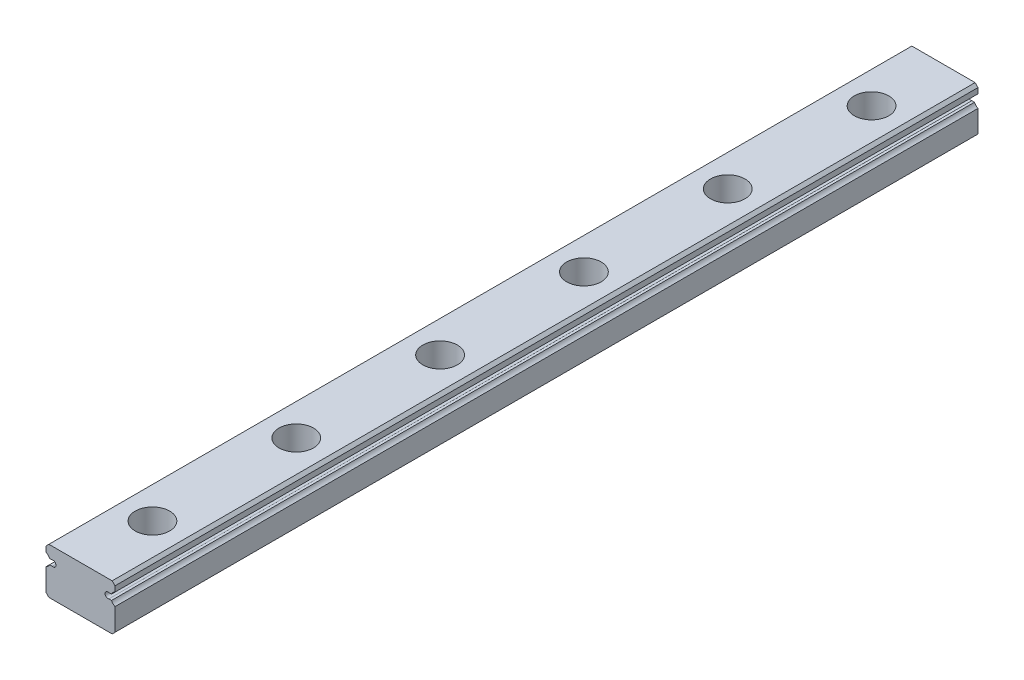
ISO-10303-21;
HEADER;
FILE_DESCRIPTION(('STEP AP214'),'2;1');
FILE_NAME('part.step','',(''),(''),'','','');
FILE_SCHEMA(('AUTOMOTIVE_DESIGN { 1 0 10303 214 1 1 1 1 }'));
ENDSEC;
DATA;
#1=APPLICATION_CONTEXT('core data for automotive mechanical design processes');
#2=APPLICATION_PROTOCOL_DEFINITION('international standard','automotive_design',2000,#1);
#3=PRODUCT_CONTEXT('',#1,'mechanical');
#4=PRODUCT('Part','Part','',(#3));
#5=PRODUCT_RELATED_PRODUCT_CATEGORY('part','',(#4));
#6=PRODUCT_DEFINITION_FORMATION('','',#4);
#7=PRODUCT_DEFINITION_CONTEXT('part definition',#1,'design');
#8=PRODUCT_DEFINITION('design','',#6,#7);
#9=PRODUCT_DEFINITION_SHAPE('','',#8);
#10=(LENGTH_UNIT() NAMED_UNIT(*) SI_UNIT(.MILLI.,.METRE.));
#11=(NAMED_UNIT(*) PLANE_ANGLE_UNIT() SI_UNIT($,.RADIAN.));
#12=(NAMED_UNIT(*) SI_UNIT($,.STERADIAN.) SOLID_ANGLE_UNIT());
#13=UNCERTAINTY_MEASURE_WITH_UNIT(LENGTH_MEASURE(1.E-05),#10,'distance_accuracy_value','');
#14=(GEOMETRIC_REPRESENTATION_CONTEXT(3) GLOBAL_UNCERTAINTY_ASSIGNED_CONTEXT((#13)) GLOBAL_UNIT_ASSIGNED_CONTEXT((#10,
#11,#12)) REPRESENTATION_CONTEXT('',''));
#15=CARTESIAN_POINT('',(0.,0.,0.));
#16=DIRECTION('',(0.,0.,1.));
#17=DIRECTION('',(1.,0.,0.));
#18=AXIS2_PLACEMENT_3D('',#15,#16,#17);
#19=CARTESIAN_POINT('',(6.,0.,150.));
#20=DIRECTION('',(-1.,0.,0.));
#21=DIRECTION('',(0.,0.,1.));
#22=AXIS2_PLACEMENT_3D('',#19,#20,#21);
#23=PLANE('',#22);
#24=DIRECTION('',(0.,1.,0.));
#25=VECTOR('',#24,1.);
#26=CARTESIAN_POINT('',(6.,0.,0.));
#27=LINE('',#26,#25);
#28=CARTESIAN_POINT('',(6.,-3.5,0.));
#29=VERTEX_POINT('',#28);
#30=CARTESIAN_POINT('',(6.,0.368911094364901,0.));
#31=VERTEX_POINT('',#30);
#32=EDGE_CURVE('E210',#29,#31,#27,.T.);
#33=ORIENTED_EDGE('',*,*,#32,.T.);
#34=DIRECTION('',(0.,0.,-1.));
#35=VECTOR('',#34,1.);
#36=CARTESIAN_POINT('',(6.,0.368911094364901,150.));
#37=LINE('',#36,#35);
#38=CARTESIAN_POINT('',(6.,0.368911094364901,150.));
#39=VERTEX_POINT('',#38);
#40=EDGE_CURVE('E11',#39,#31,#37,.T.);
#41=ORIENTED_EDGE('',*,*,#40,.F.);
#42=DIRECTION('',(0.,1.,0.));
#43=VECTOR('',#42,1.);
#44=CARTESIAN_POINT('',(6.,0.,150.));
#45=LINE('',#44,#43);
#46=CARTESIAN_POINT('',(6.,-3.5,150.));
#47=VERTEX_POINT('',#46);
#48=EDGE_CURVE('E262',#47,#39,#45,.T.);
#49=ORIENTED_EDGE('',*,*,#48,.F.);
#50=DIRECTION('',(0.,0.,-1.));
#51=VECTOR('',#50,1.);
#52=CARTESIAN_POINT('',(6.,-3.5,150.));
#53=LINE('',#52,#51);
#54=EDGE_CURVE('E206',#47,#29,#53,.T.);
#55=ORIENTED_EDGE('',*,*,#54,.T.);
#56=EDGE_LOOP('',(#33,#41,#49,#55));
#57=FACE_BOUND('',#56,.T.);
#58=ADVANCED_FACE('F43',(#57),#23,.F.);
#59=CARTESIAN_POINT('',(6.475,1.46,150.));
#60=DIRECTION('',(0.,0.,-1.));
#61=DIRECTION('',(-1.,0.,0.));
#62=AXIS2_PLACEMENT_3D('',#59,#60,#61);
#63=CYLINDRICAL_SURFACE('',#62,1.19);
#64=CARTESIAN_POINT('',(6.475,1.46,0.));
#65=DIRECTION('',(0.,0.,1.));
#66=DIRECTION('',(1.,0.,0.));
#67=AXIS2_PLACEMENT_3D('',#64,#65,#66);
#68=CIRCLE('',#67,1.19);
#69=CARTESIAN_POINT('',(5.3839110943649,0.985,0.));
#70=VERTEX_POINT('',#69);
#71=EDGE_CURVE('E213',#31,#70,#68,.F.);
#72=ORIENTED_EDGE('',*,*,#71,.T.);
#73=DIRECTION('',(0.,0.,-1.));
#74=VECTOR('',#73,1.);
#75=CARTESIAN_POINT('',(5.3839110943649,0.985,150.));
#76=LINE('',#75,#74);
#77=CARTESIAN_POINT('',(5.3839110943649,0.985,150.));
#78=VERTEX_POINT('',#77);
#79=EDGE_CURVE('E51',#78,#70,#76,.T.);
#80=ORIENTED_EDGE('',*,*,#79,.F.);
#81=CARTESIAN_POINT('',(6.475,1.46,150.));
#82=DIRECTION('',(0.,0.,1.));
#83=DIRECTION('',(1.,0.,0.));
#84=AXIS2_PLACEMENT_3D('',#81,#82,#83);
#85=CIRCLE('',#84,1.19);
#86=EDGE_CURVE('E134',#39,#78,#85,.F.);
#87=ORIENTED_EDGE('',*,*,#86,.F.);
#88=ORIENTED_EDGE('',*,*,#40,.T.);
#89=EDGE_LOOP('',(#72,#80,#87,#88));
#90=FACE_BOUND('',#89,.T.);
#91=ADVANCED_FACE('F369',(#90),#63,.F.);
#92=CARTESIAN_POINT('',(0.,0.985000000000015,150.));
#93=DIRECTION('',(0.,-1.,0.));
#94=DIRECTION('',(1.,0.,0.));
#95=AXIS2_PLACEMENT_3D('',#92,#93,#94);
#96=PLANE('',#95);
#97=DIRECTION('',(-1.,0.,0.));
#98=VECTOR('',#97,1.);
#99=CARTESIAN_POINT('',(0.,0.985000000000015,0.));
#100=LINE('',#99,#98);
#101=CARTESIAN_POINT('',(4.92112494995996,0.985000000000002,0.));
#102=VERTEX_POINT('',#101);
#103=EDGE_CURVE('E216',#70,#102,#100,.T.);
#104=ORIENTED_EDGE('',*,*,#103,.T.);
#105=DIRECTION('',(0.,0.,-1.));
#106=VECTOR('',#105,1.);
#107=CARTESIAN_POINT('',(4.92112494995996,0.985000000000002,150.));
#108=LINE('',#107,#106);
#109=CARTESIAN_POINT('',(4.92112494995996,0.985000000000002,150.));
#110=VERTEX_POINT('',#109);
#111=EDGE_CURVE('E294',#110,#102,#108,.T.);
#112=ORIENTED_EDGE('',*,*,#111,.F.);
#113=DIRECTION('',(-1.,0.,0.));
#114=VECTOR('',#113,1.);
#115=CARTESIAN_POINT('',(0.,0.985000000000015,150.));
#116=LINE('',#115,#114);
#117=EDGE_CURVE('E302',#78,#110,#116,.T.);
#118=ORIENTED_EDGE('',*,*,#117,.F.);
#119=ORIENTED_EDGE('',*,*,#79,.T.);
#120=EDGE_LOOP('',(#104,#112,#118,#119));
#121=FACE_BOUND('',#120,.T.);
#122=ADVANCED_FACE('F300',(#121),#96,.F.);
#123=CARTESIAN_POINT('',(4.765,1.46,150.));
#124=DIRECTION('',(0.,0.,-1.));
#125=DIRECTION('',(-1.,0.,0.));
#126=AXIS2_PLACEMENT_3D('',#123,#124,#125);
#127=CYLINDRICAL_SURFACE('',#126,0.5);
#128=CARTESIAN_POINT('',(4.765,1.46,0.));
#129=DIRECTION('',(0.,0.,1.));
#130=DIRECTION('',(1.,0.,0.));
#131=AXIS2_PLACEMENT_3D('',#128,#129,#130);
#132=CIRCLE('',#131,0.5);
#133=CARTESIAN_POINT('',(4.92112494995996,1.935,0.));
#134=VERTEX_POINT('',#133);
#135=EDGE_CURVE('E218',#102,#134,#132,.F.);
#136=ORIENTED_EDGE('',*,*,#135,.T.);
#137=DIRECTION('',(0.,0.,-1.));
#138=VECTOR('',#137,1.);
#139=CARTESIAN_POINT('',(4.92112494995996,1.935,150.));
#140=LINE('',#139,#138);
#141=CARTESIAN_POINT('',(4.92112494995996,1.935,150.));
#142=VERTEX_POINT('',#141);
#143=EDGE_CURVE('E292',#142,#134,#140,.T.);
#144=ORIENTED_EDGE('',*,*,#143,.F.);
#145=CARTESIAN_POINT('',(4.765,1.46,150.));
#146=DIRECTION('',(0.,0.,1.));
#147=DIRECTION('',(1.,0.,0.));
#148=AXIS2_PLACEMENT_3D('',#145,#146,#147);
#149=CIRCLE('',#148,0.5);
#150=EDGE_CURVE('E314',#110,#142,#149,.F.);
#151=ORIENTED_EDGE('',*,*,#150,.F.);
#152=ORIENTED_EDGE('',*,*,#111,.T.);
#153=EDGE_LOOP('',(#136,#144,#151,#152));
#154=FACE_BOUND('',#153,.T.);
#155=ADVANCED_FACE('F311',(#154),#127,.F.);
#156=CARTESIAN_POINT('',(0.,1.93500000000002,150.));
#157=DIRECTION('',(0.,-1.,0.));
#158=DIRECTION('',(1.,0.,0.));
#159=AXIS2_PLACEMENT_3D('',#156,#157,#158);
#160=PLANE('',#159);
#161=DIRECTION('',(-1.,0.,0.));
#162=VECTOR('',#161,1.);
#163=CARTESIAN_POINT('',(0.,1.93500000000002,0.));
#164=LINE('',#163,#162);
#165=CARTESIAN_POINT('',(5.3839110943649,1.935,0.));
#166=VERTEX_POINT('',#165);
#167=EDGE_CURVE('E221',#166,#134,#164,.T.);
#168=ORIENTED_EDGE('',*,*,#167,.F.);
#169=DIRECTION('',(0.,0.,-1.));
#170=VECTOR('',#169,1.);
#171=CARTESIAN_POINT('',(5.3839110943649,1.935,150.));
#172=LINE('',#171,#170);
#173=CARTESIAN_POINT('',(5.3839110943649,1.935,150.));
#174=VERTEX_POINT('',#173);
#175=EDGE_CURVE('E290',#174,#166,#172,.T.);
#176=ORIENTED_EDGE('',*,*,#175,.F.);
#177=DIRECTION('',(-1.,0.,0.));
#178=VECTOR('',#177,1.);
#179=CARTESIAN_POINT('',(0.,1.93500000000002,150.));
#180=LINE('',#179,#178);
#181=EDGE_CURVE('E316',#174,#142,#180,.T.);
#182=ORIENTED_EDGE('',*,*,#181,.T.);
#183=ORIENTED_EDGE('',*,*,#143,.T.);
#184=EDGE_LOOP('',(#168,#176,#182,#183));
#185=FACE_BOUND('',#184,.T.);
#186=ADVANCED_FACE('F380',(#185),#160,.T.);
#187=CARTESIAN_POINT('',(6.475,1.46,150.));
#188=DIRECTION('',(0.,0.,-1.));
#189=DIRECTION('',(-1.,0.,0.));
#190=AXIS2_PLACEMENT_3D('',#187,#188,#189);
#191=CYLINDRICAL_SURFACE('',#190,1.19);
#192=CARTESIAN_POINT('',(6.475,1.46,0.));
#193=DIRECTION('',(0.,0.,1.));
#194=DIRECTION('',(1.,0.,0.));
#195=AXIS2_PLACEMENT_3D('',#192,#193,#194);
#196=CIRCLE('',#195,1.19);
#197=CARTESIAN_POINT('',(6.,2.5510889056351,0.));
#198=VERTEX_POINT('',#197);
#199=EDGE_CURVE('E224',#166,#198,#196,.F.);
#200=ORIENTED_EDGE('',*,*,#199,.T.);
#201=DIRECTION('',(0.,0.,-1.));
#202=VECTOR('',#201,1.);
#203=CARTESIAN_POINT('',(6.,2.5510889056351,150.));
#204=LINE('',#203,#202);
#205=CARTESIAN_POINT('',(6.,2.5510889056351,150.));
#206=VERTEX_POINT('',#205);
#207=EDGE_CURVE('E287',#206,#198,#204,.T.);
#208=ORIENTED_EDGE('',*,*,#207,.F.);
#209=CARTESIAN_POINT('',(6.475,1.46,150.));
#210=DIRECTION('',(0.,0.,1.));
#211=DIRECTION('',(1.,0.,0.));
#212=AXIS2_PLACEMENT_3D('',#209,#210,#211);
#213=CIRCLE('',#212,1.19);
#214=EDGE_CURVE('E318',#174,#206,#213,.F.);
#215=ORIENTED_EDGE('',*,*,#214,.F.);
#216=ORIENTED_EDGE('',*,*,#175,.T.);
#217=EDGE_LOOP('',(#200,#208,#215,#216));
#218=FACE_BOUND('',#217,.T.);
#219=ADVANCED_FACE('F383',(#218),#191,.F.);
#220=CARTESIAN_POINT('',(6.00000000000001,0.,150.));
#221=DIRECTION('',(-1.,0.,0.));
#222=DIRECTION('',(0.,-1.,0.));
#223=AXIS2_PLACEMENT_3D('',#220,#221,#222);
#224=PLANE('',#223);
#225=DIRECTION('',(0.,1.,0.));
#226=VECTOR('',#225,1.);
#227=CARTESIAN_POINT('',(6.00000000000001,0.,0.));
#228=LINE('',#227,#226);
#229=CARTESIAN_POINT('',(6.,3.5,0.));
#230=VERTEX_POINT('',#229);
#231=EDGE_CURVE('E226',#198,#230,#228,.T.);
#232=ORIENTED_EDGE('',*,*,#231,.T.);
#233=DIRECTION('',(0.,0.,-1.));
#234=VECTOR('',#233,1.);
#235=CARTESIAN_POINT('',(6.,3.5,150.));
#236=LINE('',#235,#234);
#237=CARTESIAN_POINT('',(6.,3.5,150.));
#238=VERTEX_POINT('',#237);
#239=EDGE_CURVE('E285',#238,#230,#236,.T.);
#240=ORIENTED_EDGE('',*,*,#239,.F.);
#241=DIRECTION('',(0.,1.,0.));
#242=VECTOR('',#241,1.);
#243=CARTESIAN_POINT('',(6.00000000000001,0.,150.));
#244=LINE('',#243,#242);
#245=EDGE_CURVE('E324',#206,#238,#244,.T.);
#246=ORIENTED_EDGE('',*,*,#245,.F.);
#247=ORIENTED_EDGE('',*,*,#207,.T.);
#248=EDGE_LOOP('',(#232,#240,#246,#247));
#249=FACE_BOUND('',#248,.T.);
#250=ADVANCED_FACE('F387',(#249),#224,.F.);
#251=CARTESIAN_POINT('',(4.74999999999999,4.75,150.));
#252=DIRECTION('',(0.707106781186547,0.707106781186548,0.));
#253=DIRECTION('',(-0.707106781186548,0.707106781186547,0.));
#254=AXIS2_PLACEMENT_3D('',#251,#252,#253);
#255=PLANE('',#254);
#256=DIRECTION('',(0.707106781186548,-0.707106781186547,0.));
#257=VECTOR('',#256,1.);
#258=CARTESIAN_POINT('',(4.74999999999999,4.75,0.));
#259=LINE('',#258,#257);
#260=CARTESIAN_POINT('',(5.5,4.,0.));
#261=VERTEX_POINT('',#260);
#262=EDGE_CURVE('E229',#261,#230,#259,.T.);
#263=ORIENTED_EDGE('',*,*,#262,.F.);
#264=DIRECTION('',(0.,0.,-1.));
#265=VECTOR('',#264,1.);
#266=CARTESIAN_POINT('',(5.5,4.,150.));
#267=LINE('',#266,#265);
#268=CARTESIAN_POINT('',(5.5,4.,150.));
#269=VERTEX_POINT('',#268);
#270=EDGE_CURVE('E283',#269,#261,#267,.T.);
#271=ORIENTED_EDGE('',*,*,#270,.F.);
#272=DIRECTION('',(0.707106781186548,-0.707106781186547,0.));
#273=VECTOR('',#272,1.);
#274=CARTESIAN_POINT('',(4.74999999999999,4.75,150.));
#275=LINE('',#274,#273);
#276=EDGE_CURVE('E326',#269,#238,#275,.T.);
#277=ORIENTED_EDGE('',*,*,#276,.T.);
#278=ORIENTED_EDGE('',*,*,#239,.T.);
#279=EDGE_LOOP('',(#263,#271,#277,#278));
#280=FACE_BOUND('',#279,.T.);
#281=ADVANCED_FACE('F391',(#280),#255,.T.);
#282=CARTESIAN_POINT('',(0.,4.,150.));
#283=DIRECTION('',(0.,-1.,0.));
#284=DIRECTION('',(1.,0.,0.));
#285=AXIS2_PLACEMENT_3D('',#282,#283,#284);
#286=PLANE('',#285);
#287=CARTESIAN_POINT('',(0.,4.,137.5));
#288=DIRECTION('',(0.,1.,0.));
#289=DIRECTION('',(-1.,0.,0.));
#290=AXIS2_PLACEMENT_3D('',#287,#288,#289);
#291=CIRCLE('',#290,3.);
#292=CARTESIAN_POINT('',(-3.,4.,137.5));
#293=VERTEX_POINT('',#292);
#294=EDGE_CURVE('E745',#293,#293,#291,.T.);
#295=ORIENTED_EDGE('',*,*,#294,.F.);
#296=EDGE_LOOP('',(#295));
#297=FACE_BOUND('',#296,.T.);
#298=CARTESIAN_POINT('',(0.,4.,112.5));
#299=DIRECTION('',(0.,1.,0.));
#300=DIRECTION('',(-1.,0.,0.));
#301=AXIS2_PLACEMENT_3D('',#298,#299,#300);
#302=CIRCLE('',#301,3.);
#303=CARTESIAN_POINT('',(-3.,4.,112.5));
#304=VERTEX_POINT('',#303);
#305=EDGE_CURVE('E756',#304,#304,#302,.T.);
#306=ORIENTED_EDGE('',*,*,#305,.F.);
#307=EDGE_LOOP('',(#306));
#308=FACE_BOUND('',#307,.T.);
#309=CARTESIAN_POINT('',(0.,4.,87.5));
#310=DIRECTION('',(0.,1.,0.));
#311=DIRECTION('',(-1.,0.,0.));
#312=AXIS2_PLACEMENT_3D('',#309,#310,#311);
#313=CIRCLE('',#312,3.);
#314=CARTESIAN_POINT('',(-3.,4.,87.5));
#315=VERTEX_POINT('',#314);
#316=EDGE_CURVE('E768',#315,#315,#313,.T.);
#317=ORIENTED_EDGE('',*,*,#316,.F.);
#318=EDGE_LOOP('',(#317));
#319=FACE_BOUND('',#318,.T.);
#320=CARTESIAN_POINT('',(0.,4.,62.5));
#321=DIRECTION('',(0.,1.,0.));
#322=DIRECTION('',(-1.,0.,0.));
#323=AXIS2_PLACEMENT_3D('',#320,#321,#322);
#324=CIRCLE('',#323,3.);
#325=CARTESIAN_POINT('',(-3.,4.,62.5));
#326=VERTEX_POINT('',#325);
#327=EDGE_CURVE('E780',#326,#326,#324,.T.);
#328=ORIENTED_EDGE('',*,*,#327,.F.);
#329=EDGE_LOOP('',(#328));
#330=FACE_BOUND('',#329,.T.);
#331=CARTESIAN_POINT('',(0.,4.,37.5));
#332=DIRECTION('',(0.,1.,0.));
#333=DIRECTION('',(-1.,0.,0.));
#334=AXIS2_PLACEMENT_3D('',#331,#332,#333);
#335=CIRCLE('',#334,3.);
#336=CARTESIAN_POINT('',(-3.,4.,37.5));
#337=VERTEX_POINT('',#336);
#338=EDGE_CURVE('E792',#337,#337,#335,.T.);
#339=ORIENTED_EDGE('',*,*,#338,.F.);
#340=EDGE_LOOP('',(#339));
#341=FACE_BOUND('',#340,.T.);
#342=CARTESIAN_POINT('',(0.,4.,12.5));
#343=DIRECTION('',(0.,1.,0.));
#344=DIRECTION('',(-1.,0.,0.));
#345=AXIS2_PLACEMENT_3D('',#342,#343,#344);
#346=CIRCLE('',#345,3.);
#347=CARTESIAN_POINT('',(-3.,4.,12.5));
#348=VERTEX_POINT('',#347);
#349=EDGE_CURVE('E805',#348,#348,#346,.T.);
#350=ORIENTED_EDGE('',*,*,#349,.F.);
#351=EDGE_LOOP('',(#350));
#352=FACE_BOUND('',#351,.T.);
#353=DIRECTION('',(-1.,0.,0.));
#354=VECTOR('',#353,1.);
#355=CARTESIAN_POINT('',(0.,4.,0.));
#356=LINE('',#355,#354);
#357=CARTESIAN_POINT('',(-5.5,4.,0.));
#358=VERTEX_POINT('',#357);
#359=EDGE_CURVE('E232',#261,#358,#356,.T.);
#360=ORIENTED_EDGE('',*,*,#359,.T.);
#361=DIRECTION('',(0.,0.,-1.));
#362=VECTOR('',#361,1.);
#363=CARTESIAN_POINT('',(-5.5,4.,150.));
#364=LINE('',#363,#362);
#365=CARTESIAN_POINT('',(-5.5,4.,150.));
#366=VERTEX_POINT('',#365);
#367=EDGE_CURVE('E280',#366,#358,#364,.T.);
#368=ORIENTED_EDGE('',*,*,#367,.F.);
#369=DIRECTION('',(-1.,0.,0.));
#370=VECTOR('',#369,1.);
#371=CARTESIAN_POINT('',(0.,4.,150.));
#372=LINE('',#371,#370);
#373=EDGE_CURVE('E329',#269,#366,#372,.T.);
#374=ORIENTED_EDGE('',*,*,#373,.F.);
#375=ORIENTED_EDGE('',*,*,#270,.T.);
#376=EDGE_LOOP('',(#360,#368,#374,#375));
#377=FACE_BOUND('',#376,.T.);
#378=ADVANCED_FACE('F395',(#297,#308,#319,#330,#341,#352,#377),#286,.F.);
#379=CARTESIAN_POINT('',(-4.75,4.75,150.));
#380=DIRECTION('',(0.707106781186547,-0.707106781186548,0.));
#381=DIRECTION('',(0.707106781186548,0.707106781186547,0.));
#382=AXIS2_PLACEMENT_3D('',#379,#380,#381);
#383=PLANE('',#382);
#384=DIRECTION('',(-0.707106781186548,-0.707106781186547,0.));
#385=VECTOR('',#384,1.);
#386=CARTESIAN_POINT('',(-4.75,4.75,0.));
#387=LINE('',#386,#385);
#388=CARTESIAN_POINT('',(-6.,3.5,0.));
#389=VERTEX_POINT('',#388);
#390=EDGE_CURVE('E234',#358,#389,#387,.T.);
#391=ORIENTED_EDGE('',*,*,#390,.T.);
#392=DIRECTION('',(0.,0.,-1.));
#393=VECTOR('',#392,1.);
#394=CARTESIAN_POINT('',(-6.,3.5,150.));
#395=LINE('',#394,#393);
#396=CARTESIAN_POINT('',(-6.,3.5,150.));
#397=VERTEX_POINT('',#396);
#398=EDGE_CURVE('E278',#397,#389,#395,.T.);
#399=ORIENTED_EDGE('',*,*,#398,.F.);
#400=DIRECTION('',(-0.707106781186548,-0.707106781186547,0.));
#401=VECTOR('',#400,1.);
#402=CARTESIAN_POINT('',(-4.75,4.75,150.));
#403=LINE('',#402,#401);
#404=EDGE_CURVE('E331',#366,#397,#403,.T.);
#405=ORIENTED_EDGE('',*,*,#404,.F.);
#406=ORIENTED_EDGE('',*,*,#367,.T.);
#407=EDGE_LOOP('',(#391,#399,#405,#406));
#408=FACE_BOUND('',#407,.T.);
#409=ADVANCED_FACE('F399',(#408),#383,.F.);
#410=CARTESIAN_POINT('',(-6.,0.,150.));
#411=DIRECTION('',(-1.,0.,0.));
#412=DIRECTION('',(0.,0.,1.));
#413=AXIS2_PLACEMENT_3D('',#410,#411,#412);
#414=PLANE('',#413);
#415=DIRECTION('',(0.,1.,0.));
#416=VECTOR('',#415,1.);
#417=CARTESIAN_POINT('',(-6.,0.,0.));
#418=LINE('',#417,#416);
#419=CARTESIAN_POINT('',(-6.,2.5510889056351,0.));
#420=VERTEX_POINT('',#419);
#421=EDGE_CURVE('E237',#420,#389,#418,.T.);
#422=ORIENTED_EDGE('',*,*,#421,.F.);
#423=DIRECTION('',(0.,0.,-1.));
#424=VECTOR('',#423,1.);
#425=CARTESIAN_POINT('',(-6.,2.5510889056351,150.));
#426=LINE('',#425,#424);
#427=CARTESIAN_POINT('',(-6.,2.5510889056351,150.));
#428=VERTEX_POINT('',#427);
#429=EDGE_CURVE('E276',#428,#420,#426,.T.);
#430=ORIENTED_EDGE('',*,*,#429,.F.);
#431=DIRECTION('',(0.,1.,0.));
#432=VECTOR('',#431,1.);
#433=CARTESIAN_POINT('',(-6.,0.,150.));
#434=LINE('',#433,#432);
#435=EDGE_CURVE('E333',#428,#397,#434,.T.);
#436=ORIENTED_EDGE('',*,*,#435,.T.);
#437=ORIENTED_EDGE('',*,*,#398,.T.);
#438=EDGE_LOOP('',(#422,#430,#436,#437));
#439=FACE_BOUND('',#438,.T.);
#440=ADVANCED_FACE('F403',(#439),#414,.T.);
#441=CARTESIAN_POINT('',(-6.475,1.46,150.));
#442=DIRECTION('',(0.,0.,-1.));
#443=DIRECTION('',(-1.,0.,0.));
#444=AXIS2_PLACEMENT_3D('',#441,#442,#443);
#445=CYLINDRICAL_SURFACE('',#444,1.19);
#446=CARTESIAN_POINT('',(-6.475,1.46,0.));
#447=DIRECTION('',(0.,0.,1.));
#448=DIRECTION('',(1.,0.,0.));
#449=AXIS2_PLACEMENT_3D('',#446,#447,#448);
#450=CIRCLE('',#449,1.19);
#451=CARTESIAN_POINT('',(-5.3839110943649,1.935,0.));
#452=VERTEX_POINT('',#451);
#453=EDGE_CURVE('E240',#452,#420,#450,.T.);
#454=ORIENTED_EDGE('',*,*,#453,.F.);
#455=DIRECTION('',(0.,0.,-1.));
#456=VECTOR('',#455,1.);
#457=CARTESIAN_POINT('',(-5.3839110943649,1.935,150.));
#458=LINE('',#457,#456);
#459=CARTESIAN_POINT('',(-5.3839110943649,1.935,150.));
#460=VERTEX_POINT('',#459);
#461=EDGE_CURVE('E274',#460,#452,#458,.T.);
#462=ORIENTED_EDGE('',*,*,#461,.F.);
#463=CARTESIAN_POINT('',(-6.475,1.46,150.));
#464=DIRECTION('',(0.,0.,1.));
#465=DIRECTION('',(1.,0.,0.));
#466=AXIS2_PLACEMENT_3D('',#463,#464,#465);
#467=CIRCLE('',#466,1.19);
#468=EDGE_CURVE('E336',#460,#428,#467,.T.);
#469=ORIENTED_EDGE('',*,*,#468,.T.);
#470=ORIENTED_EDGE('',*,*,#429,.T.);
#471=EDGE_LOOP('',(#454,#462,#469,#470));
#472=FACE_BOUND('',#471,.T.);
#473=ADVANCED_FACE('F407',(#472),#445,.F.);
#474=CARTESIAN_POINT('',(0.,1.935,150.));
#475=DIRECTION('',(0.,1.,0.));
#476=DIRECTION('',(0.,0.,1.));
#477=AXIS2_PLACEMENT_3D('',#474,#475,#476);
#478=PLANE('',#477);
#479=DIRECTION('',(1.,0.,0.));
#480=VECTOR('',#479,1.);
#481=CARTESIAN_POINT('',(0.,1.935,0.));
#482=LINE('',#481,#480);
#483=CARTESIAN_POINT('',(-4.92112494995996,1.935,0.));
#484=VERTEX_POINT('',#483);
#485=EDGE_CURVE('E243',#452,#484,#482,.T.);
#486=ORIENTED_EDGE('',*,*,#485,.T.);
#487=DIRECTION('',(0.,0.,-1.));
#488=VECTOR('',#487,1.);
#489=CARTESIAN_POINT('',(-4.92112494995996,1.935,150.));
#490=LINE('',#489,#488);
#491=CARTESIAN_POINT('',(-4.92112494995996,1.935,150.));
#492=VERTEX_POINT('',#491);
#493=EDGE_CURVE('E272',#492,#484,#490,.T.);
#494=ORIENTED_EDGE('',*,*,#493,.F.);
#495=DIRECTION('',(1.,0.,0.));
#496=VECTOR('',#495,1.);
#497=CARTESIAN_POINT('',(0.,1.935,150.));
#498=LINE('',#497,#496);
#499=EDGE_CURVE('E339',#460,#492,#498,.T.);
#500=ORIENTED_EDGE('',*,*,#499,.F.);
#501=ORIENTED_EDGE('',*,*,#461,.T.);
#502=EDGE_LOOP('',(#486,#494,#500,#501));
#503=FACE_BOUND('',#502,.T.);
#504=ADVANCED_FACE('F411',(#503),#478,.F.);
#505=CARTESIAN_POINT('',(-4.765,1.46,150.));
#506=DIRECTION('',(0.,0.,-1.));
#507=DIRECTION('',(-1.,0.,0.));
#508=AXIS2_PLACEMENT_3D('',#505,#506,#507);
#509=CYLINDRICAL_SURFACE('',#508,0.5);
#510=CARTESIAN_POINT('',(-4.765,1.46,0.));
#511=DIRECTION('',(0.,0.,1.));
#512=DIRECTION('',(1.,0.,0.));
#513=AXIS2_PLACEMENT_3D('',#510,#511,#512);
#514=CIRCLE('',#513,0.5);
#515=CARTESIAN_POINT('',(-4.92112494995996,0.984999999999999,0.));
#516=VERTEX_POINT('',#515);
#517=EDGE_CURVE('E246',#516,#484,#514,.T.);
#518=ORIENTED_EDGE('',*,*,#517,.F.);
#519=DIRECTION('',(0.,0.,-1.));
#520=VECTOR('',#519,1.);
#521=CARTESIAN_POINT('',(-4.92112494995996,0.984999999999999,150.));
#522=LINE('',#521,#520);
#523=CARTESIAN_POINT('',(-4.92112494995996,0.984999999999999,150.));
#524=VERTEX_POINT('',#523);
#525=EDGE_CURVE('E270',#524,#516,#522,.T.);
#526=ORIENTED_EDGE('',*,*,#525,.F.);
#527=CARTESIAN_POINT('',(-4.765,1.46,150.));
#528=DIRECTION('',(0.,0.,1.));
#529=DIRECTION('',(1.,0.,0.));
#530=AXIS2_PLACEMENT_3D('',#527,#528,#529);
#531=CIRCLE('',#530,0.5);
#532=EDGE_CURVE('E341',#524,#492,#531,.T.);
#533=ORIENTED_EDGE('',*,*,#532,.T.);
#534=ORIENTED_EDGE('',*,*,#493,.T.);
#535=EDGE_LOOP('',(#518,#526,#533,#534));
#536=FACE_BOUND('',#535,.T.);
#537=ADVANCED_FACE('F415',(#536),#509,.F.);
#538=CARTESIAN_POINT('',(0.,0.984999999999999,150.));
#539=DIRECTION('',(0.,1.,0.));
#540=DIRECTION('',(0.,0.,1.));
#541=AXIS2_PLACEMENT_3D('',#538,#539,#540);
#542=PLANE('',#541);
#543=DIRECTION('',(1.,0.,0.));
#544=VECTOR('',#543,1.);
#545=CARTESIAN_POINT('',(0.,0.984999999999999,0.));
#546=LINE('',#545,#544);
#547=CARTESIAN_POINT('',(-5.3839110943649,0.984999999999999,0.));
#548=VERTEX_POINT('',#547);
#549=EDGE_CURVE('E249',#548,#516,#546,.T.);
#550=ORIENTED_EDGE('',*,*,#549,.F.);
#551=DIRECTION('',(0.,0.,-1.));
#552=VECTOR('',#551,1.);
#553=CARTESIAN_POINT('',(-5.3839110943649,0.984999999999999,150.));
#554=LINE('',#553,#552);
#555=CARTESIAN_POINT('',(-5.3839110943649,0.984999999999999,150.));
#556=VERTEX_POINT('',#555);
#557=EDGE_CURVE('E268',#556,#548,#554,.T.);
#558=ORIENTED_EDGE('',*,*,#557,.F.);
#559=DIRECTION('',(1.,0.,0.));
#560=VECTOR('',#559,1.);
#561=CARTESIAN_POINT('',(0.,0.984999999999999,150.));
#562=LINE('',#561,#560);
#563=EDGE_CURVE('E344',#556,#524,#562,.T.);
#564=ORIENTED_EDGE('',*,*,#563,.T.);
#565=ORIENTED_EDGE('',*,*,#525,.T.);
#566=EDGE_LOOP('',(#550,#558,#564,#565));
#567=FACE_BOUND('',#566,.T.);
#568=ADVANCED_FACE('F419',(#567),#542,.T.);
#569=CARTESIAN_POINT('',(-6.475,1.46,150.));
#570=DIRECTION('',(0.,0.,-1.));
#571=DIRECTION('',(-1.,0.,0.));
#572=AXIS2_PLACEMENT_3D('',#569,#570,#571);
#573=CYLINDRICAL_SURFACE('',#572,1.19);
#574=CARTESIAN_POINT('',(-6.475,1.46,0.));
#575=DIRECTION('',(0.,0.,1.));
#576=DIRECTION('',(1.,0.,0.));
#577=AXIS2_PLACEMENT_3D('',#574,#575,#576);
#578=CIRCLE('',#577,1.19);
#579=CARTESIAN_POINT('',(-6.,0.3689110943649,0.));
#580=VERTEX_POINT('',#579);
#581=EDGE_CURVE('E252',#580,#548,#578,.T.);
#582=ORIENTED_EDGE('',*,*,#581,.F.);
#583=DIRECTION('',(0.,0.,-1.));
#584=VECTOR('',#583,1.);
#585=CARTESIAN_POINT('',(-6.,0.3689110943649,150.));
#586=LINE('',#585,#584);
#587=CARTESIAN_POINT('',(-6.,0.3689110943649,150.));
#588=VERTEX_POINT('',#587);
#589=EDGE_CURVE('E266',#588,#580,#586,.T.);
#590=ORIENTED_EDGE('',*,*,#589,.F.);
#591=CARTESIAN_POINT('',(-6.475,1.46,150.));
#592=DIRECTION('',(0.,0.,1.));
#593=DIRECTION('',(1.,0.,0.));
#594=AXIS2_PLACEMENT_3D('',#591,#592,#593);
#595=CIRCLE('',#594,1.19);
#596=EDGE_CURVE('E347',#588,#556,#595,.T.);
#597=ORIENTED_EDGE('',*,*,#596,.T.);
#598=ORIENTED_EDGE('',*,*,#557,.T.);
#599=EDGE_LOOP('',(#582,#590,#597,#598));
#600=FACE_BOUND('',#599,.T.);
#601=ADVANCED_FACE('F423',(#600),#573,.F.);
#602=CARTESIAN_POINT('',(-6.,0.,150.));
#603=DIRECTION('',(-1.,0.,0.));
#604=DIRECTION('',(0.,0.,1.));
#605=AXIS2_PLACEMENT_3D('',#602,#603,#604);
#606=PLANE('',#605);
#607=DIRECTION('',(0.,1.,0.));
#608=VECTOR('',#607,1.);
#609=CARTESIAN_POINT('',(-6.,0.,0.));
#610=LINE('',#609,#608);
#611=CARTESIAN_POINT('',(-6.,-3.5,0.));
#612=VERTEX_POINT('',#611);
#613=EDGE_CURVE('E255',#612,#580,#610,.T.);
#614=ORIENTED_EDGE('',*,*,#613,.F.);
#615=DIRECTION('',(0.,0.,-1.));
#616=VECTOR('',#615,1.);
#617=CARTESIAN_POINT('',(-6.,-3.5,150.));
#618=LINE('',#617,#616);
#619=CARTESIAN_POINT('',(-6.,-3.5,150.));
#620=VERTEX_POINT('',#619);
#621=EDGE_CURVE('E195',#620,#612,#618,.T.);
#622=ORIENTED_EDGE('',*,*,#621,.F.);
#623=DIRECTION('',(0.,1.,0.));
#624=VECTOR('',#623,1.);
#625=CARTESIAN_POINT('',(-6.,0.,150.));
#626=LINE('',#625,#624);
#627=EDGE_CURVE('E202',#620,#588,#626,.T.);
#628=ORIENTED_EDGE('',*,*,#627,.T.);
#629=ORIENTED_EDGE('',*,*,#589,.T.);
#630=EDGE_LOOP('',(#614,#622,#628,#629));
#631=FACE_BOUND('',#630,.T.);
#632=ADVANCED_FACE('F351',(#631),#606,.T.);
#633=CARTESIAN_POINT('',(-4.75,-4.75,150.));
#634=DIRECTION('',(-0.707106781186548,-0.707106781186547,0.));
#635=DIRECTION('',(0.707106781186547,-0.707106781186548,0.));
#636=AXIS2_PLACEMENT_3D('',#633,#634,#635);
#637=PLANE('',#636);
#638=DIRECTION('',(-0.707106781186547,0.707106781186548,0.));
#639=VECTOR('',#638,1.);
#640=CARTESIAN_POINT('',(-4.75,-4.75,0.));
#641=LINE('',#640,#639);
#642=CARTESIAN_POINT('',(-5.5,-4.,0.));
#643=VERTEX_POINT('',#642);
#644=EDGE_CURVE('E190',#643,#612,#641,.T.);
#645=ORIENTED_EDGE('',*,*,#644,.F.);
#646=DIRECTION('',(0.,0.,-1.));
#647=VECTOR('',#646,1.);
#648=CARTESIAN_POINT('',(-5.5,-4.,150.));
#649=LINE('',#648,#647);
#650=CARTESIAN_POINT('',(-5.5,-4.,150.));
#651=VERTEX_POINT('',#650);
#652=EDGE_CURVE('E185',#651,#643,#649,.T.);
#653=ORIENTED_EDGE('',*,*,#652,.F.);
#654=DIRECTION('',(-0.707106781186547,0.707106781186548,0.));
#655=VECTOR('',#654,1.);
#656=CARTESIAN_POINT('',(-4.75,-4.75,150.));
#657=LINE('',#656,#655);
#658=EDGE_CURVE('E188',#651,#620,#657,.T.);
#659=ORIENTED_EDGE('',*,*,#658,.T.);
#660=ORIENTED_EDGE('',*,*,#621,.T.);
#661=EDGE_LOOP('',(#645,#653,#659,#660));
#662=FACE_BOUND('',#661,.T.);
#663=ADVANCED_FACE('F187',(#662),#637,.T.);
#664=CARTESIAN_POINT('',(0.,-4.,150.));
#665=DIRECTION('',(0.,-1.,0.));
#666=DIRECTION('',(1.,0.,0.));
#667=AXIS2_PLACEMENT_3D('',#664,#665,#666);
#668=PLANE('',#667);
#669=CARTESIAN_POINT('',(0.,-4.,137.5));
#670=DIRECTION('',(0.,1.,0.));
#671=DIRECTION('',(-1.,0.,0.));
#672=AXIS2_PLACEMENT_3D('',#669,#670,#671);
#673=CIRCLE('',#672,1.75);
#674=CARTESIAN_POINT('',(-1.75,-4.,137.5));
#675=VERTEX_POINT('',#674);
#676=EDGE_CURVE('E740',#675,#675,#673,.T.);
#677=ORIENTED_EDGE('',*,*,#676,.T.);
#678=EDGE_LOOP('',(#677));
#679=FACE_BOUND('',#678,.T.);
#680=CARTESIAN_POINT('',(0.,-4.,112.5));
#681=DIRECTION('',(0.,1.,0.));
#682=DIRECTION('',(-1.,0.,0.));
#683=AXIS2_PLACEMENT_3D('',#680,#681,#682);
#684=CIRCLE('',#683,1.75);
#685=CARTESIAN_POINT('',(-1.75,-4.,112.5));
#686=VERTEX_POINT('',#685);
#687=EDGE_CURVE('E748',#686,#686,#684,.T.);
#688=ORIENTED_EDGE('',*,*,#687,.T.);
#689=EDGE_LOOP('',(#688));
#690=FACE_BOUND('',#689,.T.);
#691=CARTESIAN_POINT('',(0.,-4.,87.5));
#692=DIRECTION('',(0.,1.,0.));
#693=DIRECTION('',(-1.,0.,0.));
#694=AXIS2_PLACEMENT_3D('',#691,#692,#693);
#695=CIRCLE('',#694,1.75);
#696=CARTESIAN_POINT('',(-1.75,-4.,87.5));
#697=VERTEX_POINT('',#696);
#698=EDGE_CURVE('E765',#697,#697,#695,.T.);
#699=ORIENTED_EDGE('',*,*,#698,.T.);
#700=EDGE_LOOP('',(#699));
#701=FACE_BOUND('',#700,.T.);
#702=CARTESIAN_POINT('',(0.,-4.,62.5));
#703=DIRECTION('',(0.,1.,0.));
#704=DIRECTION('',(-1.,0.,0.));
#705=AXIS2_PLACEMENT_3D('',#702,#703,#704);
#706=CIRCLE('',#705,1.75);
#707=CARTESIAN_POINT('',(-1.75,-4.,62.5));
#708=VERTEX_POINT('',#707);
#709=EDGE_CURVE('E777',#708,#708,#706,.T.);
#710=ORIENTED_EDGE('',*,*,#709,.T.);
#711=EDGE_LOOP('',(#710));
#712=FACE_BOUND('',#711,.T.);
#713=CARTESIAN_POINT('',(0.,-4.,37.5));
#714=DIRECTION('',(0.,1.,0.));
#715=DIRECTION('',(-1.,0.,0.));
#716=AXIS2_PLACEMENT_3D('',#713,#714,#715);
#717=CIRCLE('',#716,1.75);
#718=CARTESIAN_POINT('',(-1.75,-4.,37.5));
#719=VERTEX_POINT('',#718);
#720=EDGE_CURVE('E789',#719,#719,#717,.T.);
#721=ORIENTED_EDGE('',*,*,#720,.T.);
#722=EDGE_LOOP('',(#721));
#723=FACE_BOUND('',#722,.T.);
#724=CARTESIAN_POINT('',(0.,-4.,12.5));
#725=DIRECTION('',(0.,1.,0.));
#726=DIRECTION('',(-1.,0.,0.));
#727=AXIS2_PLACEMENT_3D('',#724,#725,#726);
#728=CIRCLE('',#727,1.75);
#729=CARTESIAN_POINT('',(-1.75,-4.,12.5));
#730=VERTEX_POINT('',#729);
#731=EDGE_CURVE('E802',#730,#730,#728,.T.);
#732=ORIENTED_EDGE('',*,*,#731,.T.);
#733=EDGE_LOOP('',(#732));
#734=FACE_BOUND('',#733,.T.);
#735=DIRECTION('',(-1.,0.,0.));
#736=VECTOR('',#735,1.);
#737=CARTESIAN_POINT('',(0.,-4.,0.));
#738=LINE('',#737,#736);
#739=CARTESIAN_POINT('',(5.5,-4.,0.));
#740=VERTEX_POINT('',#739);
#741=EDGE_CURVE('E259',#740,#643,#738,.T.);
#742=ORIENTED_EDGE('',*,*,#741,.F.);
#743=DIRECTION('',(0.,0.,-1.));
#744=VECTOR('',#743,1.);
#745=CARTESIAN_POINT('',(5.5,-4.,150.));
#746=LINE('',#745,#744);
#747=CARTESIAN_POINT('',(5.5,-4.,150.));
#748=VERTEX_POINT('',#747);
#749=EDGE_CURVE('E123',#748,#740,#746,.T.);
#750=ORIENTED_EDGE('',*,*,#749,.F.);
#751=DIRECTION('',(-1.,0.,0.));
#752=VECTOR('',#751,1.);
#753=CARTESIAN_POINT('',(0.,-4.,150.));
#754=LINE('',#753,#752);
#755=EDGE_CURVE('E199',#748,#651,#754,.T.);
#756=ORIENTED_EDGE('',*,*,#755,.T.);
#757=ORIENTED_EDGE('',*,*,#652,.T.);
#758=EDGE_LOOP('',(#742,#750,#756,#757));
#759=FACE_BOUND('',#758,.T.);
#760=ADVANCED_FACE('F204',(#679,#690,#701,#712,#723,#734,#759),#668,.T.);
#761=CARTESIAN_POINT('',(4.75,-4.75,150.));
#762=DIRECTION('',(-0.707106781186548,0.707106781186547,0.));
#763=DIRECTION('',(-0.707106781186547,-0.707106781186548,0.));
#764=AXIS2_PLACEMENT_3D('',#761,#762,#763);
#765=PLANE('',#764);
#766=DIRECTION('',(0.707106781186547,0.707106781186548,0.));
#767=VECTOR('',#766,1.);
#768=CARTESIAN_POINT('',(4.75,-4.75,0.));
#769=LINE('',#768,#767);
#770=EDGE_CURVE('E126',#740,#29,#769,.T.);
#771=ORIENTED_EDGE('',*,*,#770,.T.);
#772=ORIENTED_EDGE('',*,*,#54,.F.);
#773=DIRECTION('',(0.707106781186547,0.707106781186548,0.));
#774=VECTOR('',#773,1.);
#775=CARTESIAN_POINT('',(4.75,-4.75,150.));
#776=LINE('',#775,#774);
#777=EDGE_CURVE('E59',#748,#47,#776,.T.);
#778=ORIENTED_EDGE('',*,*,#777,.F.);
#779=ORIENTED_EDGE('',*,*,#749,.T.);
#780=EDGE_LOOP('',(#771,#772,#778,#779));
#781=FACE_BOUND('',#780,.T.);
#782=ADVANCED_FACE('F356',(#781),#765,.F.);
#783=CARTESIAN_POINT('',(0.,0.,150.));
#784=DIRECTION('',(0.,0.,1.));
#785=DIRECTION('',(1.,0.,0.));
#786=AXIS2_PLACEMENT_3D('',#783,#784,#785);
#787=PLANE('',#786);
#788=ORIENTED_EDGE('',*,*,#48,.T.);
#789=ORIENTED_EDGE('',*,*,#86,.T.);
#790=ORIENTED_EDGE('',*,*,#117,.T.);
#791=ORIENTED_EDGE('',*,*,#150,.T.);
#792=ORIENTED_EDGE('',*,*,#181,.F.);
#793=ORIENTED_EDGE('',*,*,#214,.T.);
#794=ORIENTED_EDGE('',*,*,#245,.T.);
#795=ORIENTED_EDGE('',*,*,#276,.F.);
#796=ORIENTED_EDGE('',*,*,#373,.T.);
#797=ORIENTED_EDGE('',*,*,#404,.T.);
#798=ORIENTED_EDGE('',*,*,#435,.F.);
#799=ORIENTED_EDGE('',*,*,#468,.F.);
#800=ORIENTED_EDGE('',*,*,#499,.T.);
#801=ORIENTED_EDGE('',*,*,#532,.F.);
#802=ORIENTED_EDGE('',*,*,#563,.F.);
#803=ORIENTED_EDGE('',*,*,#596,.F.);
#804=ORIENTED_EDGE('',*,*,#627,.F.);
#805=ORIENTED_EDGE('',*,*,#658,.F.);
#806=ORIENTED_EDGE('',*,*,#755,.F.);
#807=ORIENTED_EDGE('',*,*,#777,.T.);
#808=EDGE_LOOP('',(#788,#789,#790,#791,#792,#793,#794,#795,#796,#797,#798,#799,#800,#801,#802,
#803,#804,#805,#806,#807));
#809=FACE_BOUND('',#808,.T.);
#810=ADVANCED_FACE('F198',(#809),#787,.T.);
#811=CARTESIAN_POINT('',(0.,0.,0.));
#812=DIRECTION('',(0.,0.,1.));
#813=DIRECTION('',(1.,0.,0.));
#814=AXIS2_PLACEMENT_3D('',#811,#812,#813);
#815=PLANE('',#814);
#816=ORIENTED_EDGE('',*,*,#32,.F.);
#817=ORIENTED_EDGE('',*,*,#770,.F.);
#818=ORIENTED_EDGE('',*,*,#741,.T.);
#819=ORIENTED_EDGE('',*,*,#644,.T.);
#820=ORIENTED_EDGE('',*,*,#613,.T.);
#821=ORIENTED_EDGE('',*,*,#581,.T.);
#822=ORIENTED_EDGE('',*,*,#549,.T.);
#823=ORIENTED_EDGE('',*,*,#517,.T.);
#824=ORIENTED_EDGE('',*,*,#485,.F.);
#825=ORIENTED_EDGE('',*,*,#453,.T.);
#826=ORIENTED_EDGE('',*,*,#421,.T.);
#827=ORIENTED_EDGE('',*,*,#390,.F.);
#828=ORIENTED_EDGE('',*,*,#359,.F.);
#829=ORIENTED_EDGE('',*,*,#262,.T.);
#830=ORIENTED_EDGE('',*,*,#231,.F.);
#831=ORIENTED_EDGE('',*,*,#199,.F.);
#832=ORIENTED_EDGE('',*,*,#167,.T.);
#833=ORIENTED_EDGE('',*,*,#135,.F.);
#834=ORIENTED_EDGE('',*,*,#103,.F.);
#835=ORIENTED_EDGE('',*,*,#71,.F.);
#836=EDGE_LOOP('',(#816,#817,#818,#819,#820,#821,#822,#823,#824,#825,#826,#827,#828,#829,#830,
#831,#832,#833,#834,#835));
#837=FACE_BOUND('',#836,.T.);
#838=ADVANCED_FACE('F306',(#837),#815,.F.);
#839=CARTESIAN_POINT('',(0.,-0.499999999999999,12.5));
#840=DIRECTION('',(0.,1.,0.));
#841=DIRECTION('',(-1.,0.,0.));
#842=AXIS2_PLACEMENT_3D('',#839,#840,#841);
#843=CYLINDRICAL_SURFACE('',#842,3.);
#844=CARTESIAN_POINT('',(0.,-0.499999999999999,12.5));
#845=DIRECTION('',(0.,1.,0.));
#846=DIRECTION('',(-1.,0.,0.));
#847=AXIS2_PLACEMENT_3D('',#844,#845,#846);
#848=CIRCLE('',#847,3.);
#849=CARTESIAN_POINT('',(-3.,-0.5,12.5));
#850=VERTEX_POINT('',#849);
#851=EDGE_CURVE('E214',#850,#850,#848,.T.);
#852=ORIENTED_EDGE('',*,*,#851,.F.);
#853=EDGE_LOOP('',(#852));
#854=FACE_BOUND('',#853,.T.);
#855=ORIENTED_EDGE('',*,*,#349,.T.);
#856=EDGE_LOOP('',(#855));
#857=FACE_BOUND('',#856,.T.);
#858=ADVANCED_FACE('F552',(#854,#857),#843,.F.);
#859=CARTESIAN_POINT('',(0.,-0.499999999999999,12.5));
#860=DIRECTION('',(0.,1.,0.));
#861=DIRECTION('',(-1.,0.,0.));
#862=AXIS2_PLACEMENT_3D('',#859,#860,#861);
#863=PLANE('',#862);
#864=CARTESIAN_POINT('',(0.,-0.499999999999999,12.5));
#865=DIRECTION('',(0.,1.,0.));
#866=DIRECTION('',(-1.,0.,0.));
#867=AXIS2_PLACEMENT_3D('',#864,#865,#866);
#868=CIRCLE('',#867,1.75);
#869=CARTESIAN_POINT('',(-1.75,-0.499999999999999,12.5));
#870=VERTEX_POINT('',#869);
#871=EDGE_CURVE('E801',#870,#870,#868,.T.);
#872=ORIENTED_EDGE('',*,*,#871,.F.);
#873=EDGE_LOOP('',(#872));
#874=FACE_BOUND('',#873,.T.);
#875=ORIENTED_EDGE('',*,*,#851,.T.);
#876=EDGE_LOOP('',(#875));
#877=FACE_BOUND('',#876,.T.);
#878=ADVANCED_FACE('F559',(#874,#877),#863,.T.);
#879=CARTESIAN_POINT('',(0.,-4.,12.5));
#880=DIRECTION('',(0.,1.,0.));
#881=DIRECTION('',(-1.,0.,0.));
#882=AXIS2_PLACEMENT_3D('',#879,#880,#881);
#883=CYLINDRICAL_SURFACE('',#882,1.75);
#884=ORIENTED_EDGE('',*,*,#731,.F.);
#885=EDGE_LOOP('',(#884));
#886=FACE_BOUND('',#885,.T.);
#887=ORIENTED_EDGE('',*,*,#871,.T.);
#888=EDGE_LOOP('',(#887));
#889=FACE_BOUND('',#888,.T.);
#890=ADVANCED_FACE('F568',(#886,#889),#883,.F.);
#891=CARTESIAN_POINT('',(0.,-0.499999999999999,37.5));
#892=DIRECTION('',(0.,1.,0.));
#893=DIRECTION('',(-1.,0.,0.));
#894=AXIS2_PLACEMENT_3D('',#891,#892,#893);
#895=CYLINDRICAL_SURFACE('',#894,3.);
#896=CARTESIAN_POINT('',(0.,-0.499999999999999,37.5));
#897=DIRECTION('',(0.,1.,0.));
#898=DIRECTION('',(-1.,0.,0.));
#899=AXIS2_PLACEMENT_3D('',#896,#897,#898);
#900=CIRCLE('',#899,3.);
#901=CARTESIAN_POINT('',(-3.,-0.5,37.5));
#902=VERTEX_POINT('',#901);
#903=EDGE_CURVE('E798',#902,#902,#900,.T.);
#904=ORIENTED_EDGE('',*,*,#903,.F.);
#905=EDGE_LOOP('',(#904));
#906=FACE_BOUND('',#905,.T.);
#907=ORIENTED_EDGE('',*,*,#338,.T.);
#908=EDGE_LOOP('',(#907));
#909=FACE_BOUND('',#908,.T.);
#910=ADVANCED_FACE('F577',(#906,#909),#895,.F.);
#911=CARTESIAN_POINT('',(0.,-0.499999999999999,37.5));
#912=DIRECTION('',(0.,1.,0.));
#913=DIRECTION('',(-1.,0.,0.));
#914=AXIS2_PLACEMENT_3D('',#911,#912,#913);
#915=PLANE('',#914);
#916=CARTESIAN_POINT('',(0.,-0.499999999999999,37.5));
#917=DIRECTION('',(0.,1.,0.));
#918=DIRECTION('',(-1.,0.,0.));
#919=AXIS2_PLACEMENT_3D('',#916,#917,#918);
#920=CIRCLE('',#919,1.75);
#921=CARTESIAN_POINT('',(-1.75,-0.499999999999999,37.5));
#922=VERTEX_POINT('',#921);
#923=EDGE_CURVE('E795',#922,#922,#920,.T.);
#924=ORIENTED_EDGE('',*,*,#923,.F.);
#925=EDGE_LOOP('',(#924));
#926=FACE_BOUND('',#925,.T.);
#927=ORIENTED_EDGE('',*,*,#903,.T.);
#928=EDGE_LOOP('',(#927));
#929=FACE_BOUND('',#928,.T.);
#930=ADVANCED_FACE('F586',(#926,#929),#915,.T.);
#931=CARTESIAN_POINT('',(0.,-4.,37.5));
#932=DIRECTION('',(0.,1.,0.));
#933=DIRECTION('',(-1.,0.,0.));
#934=AXIS2_PLACEMENT_3D('',#931,#932,#933);
#935=CYLINDRICAL_SURFACE('',#934,1.75);
#936=ORIENTED_EDGE('',*,*,#720,.F.);
#937=EDGE_LOOP('',(#936));
#938=FACE_BOUND('',#937,.T.);
#939=ORIENTED_EDGE('',*,*,#923,.T.);
#940=EDGE_LOOP('',(#939));
#941=FACE_BOUND('',#940,.T.);
#942=ADVANCED_FACE('F595',(#938,#941),#935,.F.);
#943=CARTESIAN_POINT('',(0.,-0.499999999999999,62.5));
#944=DIRECTION('',(0.,1.,0.));
#945=DIRECTION('',(-1.,0.,0.));
#946=AXIS2_PLACEMENT_3D('',#943,#944,#945);
#947=CYLINDRICAL_SURFACE('',#946,3.);
#948=CARTESIAN_POINT('',(0.,-0.499999999999999,62.5));
#949=DIRECTION('',(0.,1.,0.));
#950=DIRECTION('',(-1.,0.,0.));
#951=AXIS2_PLACEMENT_3D('',#948,#949,#950);
#952=CIRCLE('',#951,3.);
#953=CARTESIAN_POINT('',(-3.,-0.5,62.5));
#954=VERTEX_POINT('',#953);
#955=EDGE_CURVE('E786',#954,#954,#952,.T.);
#956=ORIENTED_EDGE('',*,*,#955,.F.);
#957=EDGE_LOOP('',(#956));
#958=FACE_BOUND('',#957,.T.);
#959=ORIENTED_EDGE('',*,*,#327,.T.);
#960=EDGE_LOOP('',(#959));
#961=FACE_BOUND('',#960,.T.);
#962=ADVANCED_FACE('F604',(#958,#961),#947,.F.);
#963=CARTESIAN_POINT('',(0.,-0.499999999999999,62.5));
#964=DIRECTION('',(0.,1.,0.));
#965=DIRECTION('',(-1.,0.,0.));
#966=AXIS2_PLACEMENT_3D('',#963,#964,#965);
#967=PLANE('',#966);
#968=CARTESIAN_POINT('',(0.,-0.499999999999999,62.5));
#969=DIRECTION('',(0.,1.,0.));
#970=DIRECTION('',(-1.,0.,0.));
#971=AXIS2_PLACEMENT_3D('',#968,#969,#970);
#972=CIRCLE('',#971,1.75);
#973=CARTESIAN_POINT('',(-1.75,-0.499999999999999,62.5));
#974=VERTEX_POINT('',#973);
#975=EDGE_CURVE('E783',#974,#974,#972,.T.);
#976=ORIENTED_EDGE('',*,*,#975,.F.);
#977=EDGE_LOOP('',(#976));
#978=FACE_BOUND('',#977,.T.);
#979=ORIENTED_EDGE('',*,*,#955,.T.);
#980=EDGE_LOOP('',(#979));
#981=FACE_BOUND('',#980,.T.);
#982=ADVANCED_FACE('F613',(#978,#981),#967,.T.);
#983=CARTESIAN_POINT('',(0.,-4.,62.5));
#984=DIRECTION('',(0.,1.,0.));
#985=DIRECTION('',(-1.,0.,0.));
#986=AXIS2_PLACEMENT_3D('',#983,#984,#985);
#987=CYLINDRICAL_SURFACE('',#986,1.75);
#988=ORIENTED_EDGE('',*,*,#709,.F.);
#989=EDGE_LOOP('',(#988));
#990=FACE_BOUND('',#989,.T.);
#991=ORIENTED_EDGE('',*,*,#975,.T.);
#992=EDGE_LOOP('',(#991));
#993=FACE_BOUND('',#992,.T.);
#994=ADVANCED_FACE('F622',(#990,#993),#987,.F.);
#995=CARTESIAN_POINT('',(0.,-0.499999999999999,87.5));
#996=DIRECTION('',(0.,1.,0.));
#997=DIRECTION('',(-1.,0.,0.));
#998=AXIS2_PLACEMENT_3D('',#995,#996,#997);
#999=CYLINDRICAL_SURFACE('',#998,3.);
#1000=CARTESIAN_POINT('',(0.,-0.499999999999999,87.5));
#1001=DIRECTION('',(0.,1.,0.));
#1002=DIRECTION('',(-1.,0.,0.));
#1003=AXIS2_PLACEMENT_3D('',#1000,#1001,#1002);
#1004=CIRCLE('',#1003,3.);
#1005=CARTESIAN_POINT('',(-3.,-0.5,87.5));
#1006=VERTEX_POINT('',#1005);
#1007=EDGE_CURVE('E774',#1006,#1006,#1004,.T.);
#1008=ORIENTED_EDGE('',*,*,#1007,.F.);
#1009=EDGE_LOOP('',(#1008));
#1010=FACE_BOUND('',#1009,.T.);
#1011=ORIENTED_EDGE('',*,*,#316,.T.);
#1012=EDGE_LOOP('',(#1011));
#1013=FACE_BOUND('',#1012,.T.);
#1014=ADVANCED_FACE('F631',(#1010,#1013),#999,.F.);
#1015=CARTESIAN_POINT('',(0.,-0.499999999999999,87.5));
#1016=DIRECTION('',(0.,1.,0.));
#1017=DIRECTION('',(-1.,0.,0.));
#1018=AXIS2_PLACEMENT_3D('',#1015,#1016,#1017);
#1019=PLANE('',#1018);
#1020=CARTESIAN_POINT('',(0.,-0.499999999999999,87.5));
#1021=DIRECTION('',(0.,1.,0.));
#1022=DIRECTION('',(-1.,0.,0.));
#1023=AXIS2_PLACEMENT_3D('',#1020,#1021,#1022);
#1024=CIRCLE('',#1023,1.75);
#1025=CARTESIAN_POINT('',(-1.75,-0.499999999999999,87.5));
#1026=VERTEX_POINT('',#1025);
#1027=EDGE_CURVE('E771',#1026,#1026,#1024,.T.);
#1028=ORIENTED_EDGE('',*,*,#1027,.F.);
#1029=EDGE_LOOP('',(#1028));
#1030=FACE_BOUND('',#1029,.T.);
#1031=ORIENTED_EDGE('',*,*,#1007,.T.);
#1032=EDGE_LOOP('',(#1031));
#1033=FACE_BOUND('',#1032,.T.);
#1034=ADVANCED_FACE('F640',(#1030,#1033),#1019,.T.);
#1035=CARTESIAN_POINT('',(0.,-4.,87.5));
#1036=DIRECTION('',(0.,1.,0.));
#1037=DIRECTION('',(-1.,0.,0.));
#1038=AXIS2_PLACEMENT_3D('',#1035,#1036,#1037);
#1039=CYLINDRICAL_SURFACE('',#1038,1.75);
#1040=ORIENTED_EDGE('',*,*,#698,.F.);
#1041=EDGE_LOOP('',(#1040));
#1042=FACE_BOUND('',#1041,.T.);
#1043=ORIENTED_EDGE('',*,*,#1027,.T.);
#1044=EDGE_LOOP('',(#1043));
#1045=FACE_BOUND('',#1044,.T.);
#1046=ADVANCED_FACE('F649',(#1042,#1045),#1039,.F.);
#1047=CARTESIAN_POINT('',(0.,-0.499999999999999,112.5));
#1048=DIRECTION('',(0.,1.,0.));
#1049=DIRECTION('',(-1.,0.,0.));
#1050=AXIS2_PLACEMENT_3D('',#1047,#1048,#1049);
#1051=CYLINDRICAL_SURFACE('',#1050,3.);
#1052=CARTESIAN_POINT('',(0.,-0.499999999999999,112.5));
#1053=DIRECTION('',(0.,1.,0.));
#1054=DIRECTION('',(-1.,0.,0.));
#1055=AXIS2_PLACEMENT_3D('',#1052,#1053,#1054);
#1056=CIRCLE('',#1055,3.);
#1057=CARTESIAN_POINT('',(-3.,-0.5,112.5));
#1058=VERTEX_POINT('',#1057);
#1059=EDGE_CURVE('E762',#1058,#1058,#1056,.T.);
#1060=ORIENTED_EDGE('',*,*,#1059,.F.);
#1061=EDGE_LOOP('',(#1060));
#1062=FACE_BOUND('',#1061,.T.);
#1063=ORIENTED_EDGE('',*,*,#305,.T.);
#1064=EDGE_LOOP('',(#1063));
#1065=FACE_BOUND('',#1064,.T.);
#1066=ADVANCED_FACE('F658',(#1062,#1065),#1051,.F.);
#1067=CARTESIAN_POINT('',(0.,-0.499999999999999,112.5));
#1068=DIRECTION('',(0.,1.,0.));
#1069=DIRECTION('',(-1.,0.,0.));
#1070=AXIS2_PLACEMENT_3D('',#1067,#1068,#1069);
#1071=PLANE('',#1070);
#1072=CARTESIAN_POINT('',(0.,-0.499999999999999,112.5));
#1073=DIRECTION('',(0.,1.,0.));
#1074=DIRECTION('',(-1.,0.,0.));
#1075=AXIS2_PLACEMENT_3D('',#1072,#1073,#1074);
#1076=CIRCLE('',#1075,1.75);
#1077=CARTESIAN_POINT('',(-1.75,-0.499999999999999,112.5));
#1078=VERTEX_POINT('',#1077);
#1079=EDGE_CURVE('E759',#1078,#1078,#1076,.T.);
#1080=ORIENTED_EDGE('',*,*,#1079,.F.);
#1081=EDGE_LOOP('',(#1080));
#1082=FACE_BOUND('',#1081,.T.);
#1083=ORIENTED_EDGE('',*,*,#1059,.T.);
#1084=EDGE_LOOP('',(#1083));
#1085=FACE_BOUND('',#1084,.T.);
#1086=ADVANCED_FACE('F667',(#1082,#1085),#1071,.T.);
#1087=CARTESIAN_POINT('',(0.,-4.,112.5));
#1088=DIRECTION('',(0.,1.,0.));
#1089=DIRECTION('',(-1.,0.,0.));
#1090=AXIS2_PLACEMENT_3D('',#1087,#1088,#1089);
#1091=CYLINDRICAL_SURFACE('',#1090,1.75);
#1092=ORIENTED_EDGE('',*,*,#687,.F.);
#1093=EDGE_LOOP('',(#1092));
#1094=FACE_BOUND('',#1093,.T.);
#1095=ORIENTED_EDGE('',*,*,#1079,.T.);
#1096=EDGE_LOOP('',(#1095));
#1097=FACE_BOUND('',#1096,.T.);
#1098=ADVANCED_FACE('F676',(#1094,#1097),#1091,.F.);
#1099=CARTESIAN_POINT('',(0.,-0.499999999999999,137.5));
#1100=DIRECTION('',(0.,1.,0.));
#1101=DIRECTION('',(-1.,0.,0.));
#1102=AXIS2_PLACEMENT_3D('',#1099,#1100,#1101);
#1103=CYLINDRICAL_SURFACE('',#1102,3.);
#1104=CARTESIAN_POINT('',(0.,-0.499999999999999,137.5));
#1105=DIRECTION('',(0.,1.,0.));
#1106=DIRECTION('',(-1.,0.,0.));
#1107=AXIS2_PLACEMENT_3D('',#1104,#1105,#1106);
#1108=CIRCLE('',#1107,3.);
#1109=CARTESIAN_POINT('',(-3.,-0.5,137.5));
#1110=VERTEX_POINT('',#1109);
#1111=EDGE_CURVE('E744',#1110,#1110,#1108,.T.);
#1112=ORIENTED_EDGE('',*,*,#1111,.F.);
#1113=EDGE_LOOP('',(#1112));
#1114=FACE_BOUND('',#1113,.T.);
#1115=ORIENTED_EDGE('',*,*,#294,.T.);
#1116=EDGE_LOOP('',(#1115));
#1117=FACE_BOUND('',#1116,.T.);
#1118=ADVANCED_FACE('F685',(#1114,#1117),#1103,.F.);
#1119=CARTESIAN_POINT('',(0.,-0.499999999999999,137.5));
#1120=DIRECTION('',(0.,1.,0.));
#1121=DIRECTION('',(-1.,0.,0.));
#1122=AXIS2_PLACEMENT_3D('',#1119,#1120,#1121);
#1123=PLANE('',#1122);
#1124=CARTESIAN_POINT('',(0.,-0.499999999999999,137.5));
#1125=DIRECTION('',(0.,1.,0.));
#1126=DIRECTION('',(-1.,0.,0.));
#1127=AXIS2_PLACEMENT_3D('',#1124,#1125,#1126);
#1128=CIRCLE('',#1127,1.75);
#1129=CARTESIAN_POINT('',(-1.75,-0.499999999999999,137.5));
#1130=VERTEX_POINT('',#1129);
#1131=EDGE_CURVE('E743',#1130,#1130,#1128,.T.);
#1132=ORIENTED_EDGE('',*,*,#1131,.F.);
#1133=EDGE_LOOP('',(#1132));
#1134=FACE_BOUND('',#1133,.T.);
#1135=ORIENTED_EDGE('',*,*,#1111,.T.);
#1136=EDGE_LOOP('',(#1135));
#1137=FACE_BOUND('',#1136,.T.);
#1138=ADVANCED_FACE('F694',(#1134,#1137),#1123,.T.);
#1139=CARTESIAN_POINT('',(0.,-4.,137.5));
#1140=DIRECTION('',(0.,1.,0.));
#1141=DIRECTION('',(-1.,0.,0.));
#1142=AXIS2_PLACEMENT_3D('',#1139,#1140,#1141);
#1143=CYLINDRICAL_SURFACE('',#1142,1.75);
#1144=ORIENTED_EDGE('',*,*,#676,.F.);
#1145=EDGE_LOOP('',(#1144));
#1146=FACE_BOUND('',#1145,.T.);
#1147=ORIENTED_EDGE('',*,*,#1131,.T.);
#1148=EDGE_LOOP('',(#1147));
#1149=FACE_BOUND('',#1148,.T.);
#1150=ADVANCED_FACE('F703',(#1146,#1149),#1143,.F.);
#1151=CLOSED_SHELL('',(#58,#91,#122,#155,#186,#219,#250,#281,#378,#409,#440,#473,#504,#537,#568,
#601,#632,#663,#760,#782,#810,#838,#858,#878,#890,#910,#930,#942,#962,#982,#994,#1014,#1034,
#1046,#1066,#1086,#1098,#1118,#1138,#1150));
#1152=MANIFOLD_SOLID_BREP('B2',#1151);
#1153=ADVANCED_BREP_SHAPE_REPRESENTATION('',(#18,#1152),#14);
#1154=SHAPE_DEFINITION_REPRESENTATION(#9,#1153);
ENDSEC;
END-ISO-10303-21;
